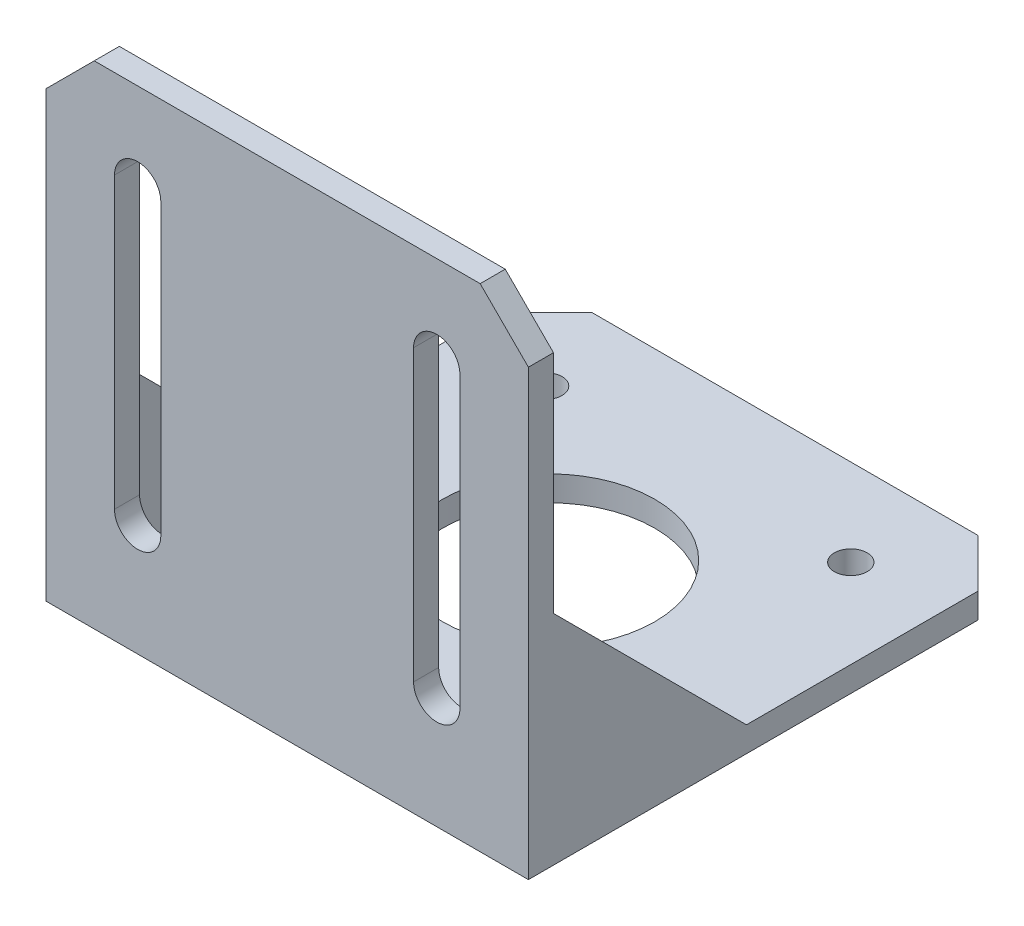
ISO-10303-21;
HEADER;
FILE_DESCRIPTION(('STEP AP214'),'2;1');
FILE_NAME('part.step','',(''),(''),'','','');
FILE_SCHEMA(('AUTOMOTIVE_DESIGN { 1 0 10303 214 1 1 1 1 }'));
ENDSEC;
DATA;
#1=APPLICATION_CONTEXT('core data for automotive mechanical design processes');
#2=APPLICATION_PROTOCOL_DEFINITION('international standard','automotive_design',2000,#1);
#3=PRODUCT_CONTEXT('',#1,'mechanical');
#4=PRODUCT('Part','Part','',(#3));
#5=PRODUCT_RELATED_PRODUCT_CATEGORY('part','',(#4));
#6=PRODUCT_DEFINITION_FORMATION('','',#4);
#7=PRODUCT_DEFINITION_CONTEXT('part definition',#1,'design');
#8=PRODUCT_DEFINITION('design','',#6,#7);
#9=PRODUCT_DEFINITION_SHAPE('','',#8);
#10=(LENGTH_UNIT() NAMED_UNIT(*) SI_UNIT(.MILLI.,.METRE.));
#11=(NAMED_UNIT(*) PLANE_ANGLE_UNIT() SI_UNIT($,.RADIAN.));
#12=(NAMED_UNIT(*) SI_UNIT($,.STERADIAN.) SOLID_ANGLE_UNIT());
#13=UNCERTAINTY_MEASURE_WITH_UNIT(LENGTH_MEASURE(1.E-05),#10,'distance_accuracy_value','');
#14=(GEOMETRIC_REPRESENTATION_CONTEXT(3) GLOBAL_UNCERTAINTY_ASSIGNED_CONTEXT((#13)) GLOBAL_UNIT_ASSIGNED_CONTEXT((#10,
#11,#12)) REPRESENTATION_CONTEXT('',''));
#15=CARTESIAN_POINT('',(0.,0.,0.));
#16=DIRECTION('',(0.,0.,1.));
#17=DIRECTION('',(1.,0.,0.));
#18=AXIS2_PLACEMENT_3D('',#15,#16,#17);
#19=CARTESIAN_POINT('',(0.,2.6,0.));
#20=DIRECTION('',(0.,-1.,0.));
#21=DIRECTION('',(0.,0.,-1.));
#22=AXIS2_PLACEMENT_3D('',#19,#20,#21);
#23=PLANE('',#22);
#24=CARTESIAN_POINT('',(0.,2.6,0.));
#25=DIRECTION('',(0.,1.,0.));
#26=DIRECTION('',(0.,0.,1.));
#27=AXIS2_PLACEMENT_3D('',#24,#25,#26);
#28=CIRCLE('',#27,11.);
#29=CARTESIAN_POINT('',(0.,2.6,11.));
#30=VERTEX_POINT('',#29);
#31=EDGE_CURVE('E316',#30,#30,#28,.T.);
#32=ORIENTED_EDGE('',*,*,#31,.F.);
#33=EDGE_LOOP('',(#32));
#34=FACE_BOUND('',#33,.T.);
#35=CARTESIAN_POINT('',(15.8163265306123,2.6,15.5));
#36=DIRECTION('',(0.,1.,0.));
#37=DIRECTION('',(0.,0.,1.));
#38=AXIS2_PLACEMENT_3D('',#35,#36,#37);
#39=CIRCLE('',#38,1.7);
#40=CARTESIAN_POINT('',(15.8163265306123,2.6,17.2));
#41=VERTEX_POINT('',#40);
#42=EDGE_CURVE('E322',#41,#41,#39,.T.);
#43=ORIENTED_EDGE('',*,*,#42,.F.);
#44=EDGE_LOOP('',(#43));
#45=FACE_BOUND('',#44,.T.);
#46=CARTESIAN_POINT('',(-15.8163265306122,2.6,15.5));
#47=DIRECTION('',(0.,1.,0.));
#48=DIRECTION('',(0.,0.,1.));
#49=AXIS2_PLACEMENT_3D('',#46,#47,#48);
#50=CIRCLE('',#49,1.7);
#51=CARTESIAN_POINT('',(-15.8163265306122,2.6,17.2));
#52=VERTEX_POINT('',#51);
#53=EDGE_CURVE('E328',#52,#52,#50,.T.);
#54=ORIENTED_EDGE('',*,*,#53,.F.);
#55=EDGE_LOOP('',(#54));
#56=FACE_BOUND('',#55,.T.);
#57=CARTESIAN_POINT('',(15.8163265306123,2.6,-15.5));
#58=DIRECTION('',(0.,1.,0.));
#59=DIRECTION('',(0.,0.,1.));
#60=AXIS2_PLACEMENT_3D('',#57,#58,#59);
#61=CIRCLE('',#60,1.7);
#62=CARTESIAN_POINT('',(15.8163265306123,2.6,-13.8));
#63=VERTEX_POINT('',#62);
#64=EDGE_CURVE('E334',#63,#63,#61,.T.);
#65=ORIENTED_EDGE('',*,*,#64,.F.);
#66=EDGE_LOOP('',(#65));
#67=FACE_BOUND('',#66,.T.);
#68=CARTESIAN_POINT('',(-15.8163265306122,2.6,-15.5));
#69=DIRECTION('',(0.,1.,0.));
#70=DIRECTION('',(0.,0.,1.));
#71=AXIS2_PLACEMENT_3D('',#68,#69,#70);
#72=CIRCLE('',#71,1.7);
#73=CARTESIAN_POINT('',(-15.8163265306122,2.6,-13.8));
#74=VERTEX_POINT('',#73);
#75=EDGE_CURVE('E340',#74,#74,#72,.T.);
#76=ORIENTED_EDGE('',*,*,#75,.F.);
#77=EDGE_LOOP('',(#76));
#78=FACE_BOUND('',#77,.T.);
#79=DIRECTION('',(0.,0.,1.));
#80=VECTOR('',#79,1.);
#81=CARTESIAN_POINT('',(-22.4,2.6,24.5));
#82=LINE('',#81,#80);
#83=CARTESIAN_POINT('',(-22.4,2.6,4.50000000000001));
#84=VERTEX_POINT('',#83);
#85=CARTESIAN_POINT('',(-22.4,2.6,24.1));
#86=VERTEX_POINT('',#85);
#87=EDGE_CURVE('E219',#84,#86,#82,.T.);
#88=ORIENTED_EDGE('',*,*,#87,.T.);
#89=DIRECTION('',(1.,0.,0.));
#90=VECTOR('',#89,1.);
#91=CARTESIAN_POINT('',(0.,2.6,24.1));
#92=LINE('',#91,#90);
#93=CARTESIAN_POINT('',(22.4,2.6,24.1));
#94=VERTEX_POINT('',#93);
#95=EDGE_CURVE('E212',#86,#94,#92,.T.);
#96=ORIENTED_EDGE('',*,*,#95,.T.);
#97=DIRECTION('',(0.,0.,1.));
#98=VECTOR('',#97,1.);
#99=CARTESIAN_POINT('',(22.4,2.6,24.5));
#100=LINE('',#99,#98);
#101=CARTESIAN_POINT('',(22.4,2.6,4.50000000000001));
#102=VERTEX_POINT('',#101);
#103=EDGE_CURVE('E194',#102,#94,#100,.T.);
#104=ORIENTED_EDGE('',*,*,#103,.F.);
#105=DIRECTION('',(1.,0.,0.));
#106=VECTOR('',#105,1.);
#107=CARTESIAN_POINT('',(22.4,2.6,4.50000000000001));
#108=LINE('',#107,#106);
#109=CARTESIAN_POINT('',(25.,2.6,4.50000000000001));
#110=VERTEX_POINT('',#109);
#111=EDGE_CURVE('E201',#102,#110,#108,.T.);
#112=ORIENTED_EDGE('',*,*,#111,.T.);
#113=DIRECTION('',(0.,0.,-1.));
#114=VECTOR('',#113,1.);
#115=CARTESIAN_POINT('',(25.,2.6,24.5));
#116=LINE('',#115,#114);
#117=CARTESIAN_POINT('',(25.,2.6,-19.5));
#118=VERTEX_POINT('',#117);
#119=EDGE_CURVE('E346',#110,#118,#116,.T.);
#120=ORIENTED_EDGE('',*,*,#119,.T.);
#121=DIRECTION('',(0.707106781186546,0.,0.707106781186549));
#122=VECTOR('',#121,1.);
#123=CARTESIAN_POINT('',(20.,2.6,-24.5));
#124=LINE('',#123,#122);
#125=CARTESIAN_POINT('',(20.,2.6,-24.5));
#126=VERTEX_POINT('',#125);
#127=EDGE_CURVE('E376',#118,#126,#124,.F.);
#128=ORIENTED_EDGE('',*,*,#127,.T.);
#129=DIRECTION('',(-1.,0.,0.));
#130=VECTOR('',#129,1.);
#131=CARTESIAN_POINT('',(-25.,2.6,-24.5));
#132=LINE('',#131,#130);
#133=CARTESIAN_POINT('',(-20.,2.6,-24.5));
#134=VERTEX_POINT('',#133);
#135=EDGE_CURVE('E348',#126,#134,#132,.T.);
#136=ORIENTED_EDGE('',*,*,#135,.T.);
#137=DIRECTION('',(0.707106781186549,0.,-0.707106781186546));
#138=VECTOR('',#137,1.);
#139=CARTESIAN_POINT('',(-25.,2.6,-19.5));
#140=LINE('',#139,#138);
#141=CARTESIAN_POINT('',(-25.,2.6,-19.5));
#142=VERTEX_POINT('',#141);
#143=EDGE_CURVE('E374',#134,#142,#140,.F.);
#144=ORIENTED_EDGE('',*,*,#143,.T.);
#145=DIRECTION('',(0.,0.,1.));
#146=VECTOR('',#145,1.);
#147=CARTESIAN_POINT('',(-25.,2.6,24.5));
#148=LINE('',#147,#146);
#149=CARTESIAN_POINT('',(-25.,2.6,4.50000000000001));
#150=VERTEX_POINT('',#149);
#151=EDGE_CURVE('E352',#142,#150,#148,.T.);
#152=ORIENTED_EDGE('',*,*,#151,.T.);
#153=DIRECTION('',(-1.,0.,0.));
#154=VECTOR('',#153,1.);
#155=CARTESIAN_POINT('',(-22.4,2.6,4.50000000000001));
#156=LINE('',#155,#154);
#157=EDGE_CURVE('E229',#84,#150,#156,.T.);
#158=ORIENTED_EDGE('',*,*,#157,.F.);
#159=EDGE_LOOP('',(#88,#96,#104,#112,#120,#128,#136,#144,#152,#158));
#160=FACE_BOUND('',#159,.T.);
#161=ADVANCED_FACE('F39',(#34,#45,#56,#67,#78,#160),#23,.F.);
#162=CARTESIAN_POINT('',(0.,0.,24.5));
#163=DIRECTION('',(0.,0.,-1.));
#164=DIRECTION('',(-1.,0.,0.));
#165=AXIS2_PLACEMENT_3D('',#162,#163,#164);
#166=PLANE('',#165);
#167=DIRECTION('',(0.,1.,0.));
#168=VECTOR('',#167,1.);
#169=CARTESIAN_POINT('',(17.9,41.8,24.5));
#170=LINE('',#169,#168);
#171=CARTESIAN_POINT('',(17.9,11.8,24.5));
#172=VERTEX_POINT('',#171);
#173=CARTESIAN_POINT('',(17.9,41.8,24.5));
#174=VERTEX_POINT('',#173);
#175=EDGE_CURVE('E238',#172,#174,#170,.T.);
#176=ORIENTED_EDGE('',*,*,#175,.T.);
#177=CARTESIAN_POINT('',(15.5,41.8,24.5));
#178=DIRECTION('',(0.,0.,1.));
#179=DIRECTION('',(-1.,0.,0.));
#180=AXIS2_PLACEMENT_3D('',#177,#178,#179);
#181=CIRCLE('',#180,2.4);
#182=CARTESIAN_POINT('',(13.1,41.8,24.5));
#183=VERTEX_POINT('',#182);
#184=EDGE_CURVE('E232',#174,#183,#181,.T.);
#185=ORIENTED_EDGE('',*,*,#184,.T.);
#186=DIRECTION('',(0.,-1.,0.));
#187=VECTOR('',#186,1.);
#188=CARTESIAN_POINT('',(13.1,41.8,24.5));
#189=LINE('',#188,#187);
#190=CARTESIAN_POINT('',(13.1,11.8,24.5));
#191=VERTEX_POINT('',#190);
#192=EDGE_CURVE('E248',#183,#191,#189,.T.);
#193=ORIENTED_EDGE('',*,*,#192,.T.);
#194=CARTESIAN_POINT('',(15.5,11.8,24.5));
#195=DIRECTION('',(0.,0.,1.));
#196=DIRECTION('',(-1.,0.,0.));
#197=AXIS2_PLACEMENT_3D('',#194,#195,#196);
#198=CIRCLE('',#197,2.4);
#199=EDGE_CURVE('E251',#191,#172,#198,.T.);
#200=ORIENTED_EDGE('',*,*,#199,.T.);
#201=EDGE_LOOP('',(#176,#185,#193,#200));
#202=FACE_BOUND('',#201,.T.);
#203=DIRECTION('',(0.,1.,0.));
#204=VECTOR('',#203,1.);
#205=CARTESIAN_POINT('',(-13.1,41.8,24.5));
#206=LINE('',#205,#204);
#207=CARTESIAN_POINT('',(-13.1,11.8,24.5));
#208=VERTEX_POINT('',#207);
#209=CARTESIAN_POINT('',(-13.1,41.8,24.5));
#210=VERTEX_POINT('',#209);
#211=EDGE_CURVE('E269',#208,#210,#206,.T.);
#212=ORIENTED_EDGE('',*,*,#211,.T.);
#213=CARTESIAN_POINT('',(-15.5,41.8,24.5));
#214=DIRECTION('',(0.,0.,1.));
#215=DIRECTION('',(1.,0.,0.));
#216=AXIS2_PLACEMENT_3D('',#213,#214,#215);
#217=CIRCLE('',#216,2.4);
#218=CARTESIAN_POINT('',(-17.9,41.8,24.5));
#219=VERTEX_POINT('',#218);
#220=EDGE_CURVE('E265',#210,#219,#217,.T.);
#221=ORIENTED_EDGE('',*,*,#220,.T.);
#222=DIRECTION('',(0.,-1.,0.));
#223=VECTOR('',#222,1.);
#224=CARTESIAN_POINT('',(-17.9,41.8,24.5));
#225=LINE('',#224,#223);
#226=CARTESIAN_POINT('',(-17.9,11.8,24.5));
#227=VERTEX_POINT('',#226);
#228=EDGE_CURVE('E279',#219,#227,#225,.T.);
#229=ORIENTED_EDGE('',*,*,#228,.T.);
#230=CARTESIAN_POINT('',(-15.5,11.8,24.5));
#231=DIRECTION('',(0.,0.,1.));
#232=DIRECTION('',(1.,0.,0.));
#233=AXIS2_PLACEMENT_3D('',#230,#231,#232);
#234=CIRCLE('',#233,2.4);
#235=EDGE_CURVE('E282',#227,#208,#234,.T.);
#236=ORIENTED_EDGE('',*,*,#235,.T.);
#237=EDGE_LOOP('',(#212,#221,#229,#236));
#238=FACE_BOUND('',#237,.T.);
#239=DIRECTION('',(0.,1.,0.));
#240=VECTOR('',#239,1.);
#241=CARTESIAN_POINT('',(22.4,22.6,24.5));
#242=LINE('',#241,#240);
#243=CARTESIAN_POINT('',(22.4,2.99999999999999,24.5));
#244=VERTEX_POINT('',#243);
#245=CARTESIAN_POINT('',(22.4,22.6,24.5));
#246=VERTEX_POINT('',#245);
#247=EDGE_CURVE('E195',#244,#246,#242,.T.);
#248=ORIENTED_EDGE('',*,*,#247,.F.);
#249=DIRECTION('',(-1.,0.,0.));
#250=VECTOR('',#249,1.);
#251=CARTESIAN_POINT('',(0.,2.99999999999999,24.5));
#252=LINE('',#251,#250);
#253=CARTESIAN_POINT('',(-22.4,2.99999999999999,24.5));
#254=VERTEX_POINT('',#253);
#255=EDGE_CURVE('E47',#244,#254,#252,.T.);
#256=ORIENTED_EDGE('',*,*,#255,.T.);
#257=DIRECTION('',(0.,1.,0.));
#258=VECTOR('',#257,1.);
#259=CARTESIAN_POINT('',(-22.4,22.6,24.5));
#260=LINE('',#259,#258);
#261=CARTESIAN_POINT('',(-22.4,22.6,24.5));
#262=VERTEX_POINT('',#261);
#263=EDGE_CURVE('E221',#254,#262,#260,.T.);
#264=ORIENTED_EDGE('',*,*,#263,.T.);
#265=DIRECTION('',(-1.,0.,0.));
#266=VECTOR('',#265,1.);
#267=CARTESIAN_POINT('',(-22.4,22.6,24.5));
#268=LINE('',#267,#266);
#269=CARTESIAN_POINT('',(-25.,22.6,24.5));
#270=VERTEX_POINT('',#269);
#271=EDGE_CURVE('E226',#262,#270,#268,.T.);
#272=ORIENTED_EDGE('',*,*,#271,.T.);
#273=DIRECTION('',(0.,-1.,0.));
#274=VECTOR('',#273,1.);
#275=CARTESIAN_POINT('',(-25.,0.,24.5));
#276=LINE('',#275,#274);
#277=CARTESIAN_POINT('',(-25.,46.,24.5));
#278=VERTEX_POINT('',#277);
#279=EDGE_CURVE('E296',#278,#270,#276,.T.);
#280=ORIENTED_EDGE('',*,*,#279,.F.);
#281=DIRECTION('',(-0.707106781186549,-0.707106781186546,0.));
#282=VECTOR('',#281,1.);
#283=CARTESIAN_POINT('',(-35.4999999999999,35.5000000000001,24.5));
#284=LINE('',#283,#282);
#285=CARTESIAN_POINT('',(-20.,51.,24.5));
#286=VERTEX_POINT('',#285);
#287=EDGE_CURVE('E389',#278,#286,#284,.F.);
#288=ORIENTED_EDGE('',*,*,#287,.T.);
#289=DIRECTION('',(-1.,0.,0.));
#290=VECTOR('',#289,1.);
#291=CARTESIAN_POINT('',(-25.,51.,24.5));
#292=LINE('',#291,#290);
#293=CARTESIAN_POINT('',(20.,51.,24.5));
#294=VERTEX_POINT('',#293);
#295=EDGE_CURVE('E300',#294,#286,#292,.T.);
#296=ORIENTED_EDGE('',*,*,#295,.F.);
#297=DIRECTION('',(-0.707106781186546,0.707106781186549,0.));
#298=VECTOR('',#297,1.);
#299=CARTESIAN_POINT('',(35.5,35.4999999999999,24.5));
#300=LINE('',#299,#298);
#301=CARTESIAN_POINT('',(25.,46.,24.5));
#302=VERTEX_POINT('',#301);
#303=EDGE_CURVE('E391',#294,#302,#300,.F.);
#304=ORIENTED_EDGE('',*,*,#303,.T.);
#305=DIRECTION('',(0.,1.,0.));
#306=VECTOR('',#305,1.);
#307=CARTESIAN_POINT('',(25.,0.,24.5));
#308=LINE('',#307,#306);
#309=CARTESIAN_POINT('',(25.,22.6,24.5));
#310=VERTEX_POINT('',#309);
#311=EDGE_CURVE('E311',#310,#302,#308,.T.);
#312=ORIENTED_EDGE('',*,*,#311,.F.);
#313=DIRECTION('',(1.,0.,0.));
#314=VECTOR('',#313,1.);
#315=CARTESIAN_POINT('',(22.4,22.6,24.5));
#316=LINE('',#315,#314);
#317=EDGE_CURVE('E207',#246,#310,#316,.T.);
#318=ORIENTED_EDGE('',*,*,#317,.F.);
#319=EDGE_LOOP('',(#248,#256,#264,#272,#280,#288,#296,#304,#312,#318));
#320=FACE_BOUND('',#319,.T.);
#321=ADVANCED_FACE('F414',(#202,#238,#320),#166,.T.);
#322=CARTESIAN_POINT('',(0.,0.,0.));
#323=DIRECTION('',(0.,-1.,0.));
#324=DIRECTION('',(0.,0.,-1.));
#325=AXIS2_PLACEMENT_3D('',#322,#323,#324);
#326=PLANE('',#325);
#327=CARTESIAN_POINT('',(15.8163265306123,0.,15.5));
#328=DIRECTION('',(0.,1.,0.));
#329=DIRECTION('',(0.,0.,1.));
#330=AXIS2_PLACEMENT_3D('',#327,#328,#329);
#331=CIRCLE('',#330,1.7);
#332=CARTESIAN_POINT('',(15.8163265306123,0.,17.2));
#333=VERTEX_POINT('',#332);
#334=EDGE_CURVE('E319',#333,#333,#331,.T.);
#335=ORIENTED_EDGE('',*,*,#334,.T.);
#336=EDGE_LOOP('',(#335));
#337=FACE_BOUND('',#336,.T.);
#338=CARTESIAN_POINT('',(15.8163265306123,0.,-15.5));
#339=DIRECTION('',(0.,1.,0.));
#340=DIRECTION('',(0.,0.,1.));
#341=AXIS2_PLACEMENT_3D('',#338,#339,#340);
#342=CIRCLE('',#341,1.7);
#343=CARTESIAN_POINT('',(15.8163265306123,0.,-13.8));
#344=VERTEX_POINT('',#343);
#345=EDGE_CURVE('E331',#344,#344,#342,.T.);
#346=ORIENTED_EDGE('',*,*,#345,.T.);
#347=EDGE_LOOP('',(#346));
#348=FACE_BOUND('',#347,.T.);
#349=DIRECTION('',(-1.,0.,0.));
#350=VECTOR('',#349,1.);
#351=CARTESIAN_POINT('',(-25.,0.,-24.5));
#352=LINE('',#351,#350);
#353=CARTESIAN_POINT('',(20.,0.,-24.5));
#354=VERTEX_POINT('',#353);
#355=CARTESIAN_POINT('',(-20.,0.,-24.5));
#356=VERTEX_POINT('',#355);
#357=EDGE_CURVE('E357',#354,#356,#352,.T.);
#358=ORIENTED_EDGE('',*,*,#357,.F.);
#359=DIRECTION('',(-0.707106781186546,0.,-0.707106781186549));
#360=VECTOR('',#359,1.);
#361=CARTESIAN_POINT('',(22.25,0.,-22.2499999999999));
#362=LINE('',#361,#360);
#363=CARTESIAN_POINT('',(25.,0.,-19.5));
#364=VERTEX_POINT('',#363);
#365=EDGE_CURVE('E368',#354,#364,#362,.F.);
#366=ORIENTED_EDGE('',*,*,#365,.T.);
#367=DIRECTION('',(0.,0.,-1.));
#368=VECTOR('',#367,1.);
#369=CARTESIAN_POINT('',(25.,0.,24.5));
#370=LINE('',#369,#368);
#371=CARTESIAN_POINT('',(25.,0.,27.1));
#372=VERTEX_POINT('',#371);
#373=EDGE_CURVE('E343',#372,#364,#370,.T.);
#374=ORIENTED_EDGE('',*,*,#373,.F.);
#375=DIRECTION('',(1.,0.,0.));
#376=VECTOR('',#375,1.);
#377=CARTESIAN_POINT('',(-25.,0.,27.1));
#378=LINE('',#377,#376);
#379=CARTESIAN_POINT('',(-25.,0.,27.1));
#380=VERTEX_POINT('',#379);
#381=EDGE_CURVE('E299',#380,#372,#378,.T.);
#382=ORIENTED_EDGE('',*,*,#381,.F.);
#383=DIRECTION('',(0.,0.,1.));
#384=VECTOR('',#383,1.);
#385=CARTESIAN_POINT('',(-25.,0.,24.5));
#386=LINE('',#385,#384);
#387=CARTESIAN_POINT('',(-25.,0.,-19.5));
#388=VERTEX_POINT('',#387);
#389=EDGE_CURVE('E349',#388,#380,#386,.T.);
#390=ORIENTED_EDGE('',*,*,#389,.F.);
#391=DIRECTION('',(-0.707106781186549,0.,0.707106781186546));
#392=VECTOR('',#391,1.);
#393=CARTESIAN_POINT('',(-22.2499999999999,0.,-22.25));
#394=LINE('',#393,#392);
#395=EDGE_CURVE('E366',#388,#356,#394,.F.);
#396=ORIENTED_EDGE('',*,*,#395,.T.);
#397=EDGE_LOOP('',(#358,#366,#374,#382,#390,#396));
#398=FACE_BOUND('',#397,.T.);
#399=CARTESIAN_POINT('',(-15.8163265306122,0.,-15.5));
#400=DIRECTION('',(0.,1.,0.));
#401=DIRECTION('',(0.,0.,1.));
#402=AXIS2_PLACEMENT_3D('',#399,#400,#401);
#403=CIRCLE('',#402,1.7);
#404=CARTESIAN_POINT('',(-15.8163265306122,0.,-13.8));
#405=VERTEX_POINT('',#404);
#406=EDGE_CURVE('E337',#405,#405,#403,.T.);
#407=ORIENTED_EDGE('',*,*,#406,.T.);
#408=EDGE_LOOP('',(#407));
#409=FACE_BOUND('',#408,.T.);
#410=CARTESIAN_POINT('',(-15.8163265306122,0.,15.5));
#411=DIRECTION('',(0.,1.,0.));
#412=DIRECTION('',(0.,0.,1.));
#413=AXIS2_PLACEMENT_3D('',#410,#411,#412);
#414=CIRCLE('',#413,1.7);
#415=CARTESIAN_POINT('',(-15.8163265306122,0.,17.2));
#416=VERTEX_POINT('',#415);
#417=EDGE_CURVE('E325',#416,#416,#414,.T.);
#418=ORIENTED_EDGE('',*,*,#417,.T.);
#419=EDGE_LOOP('',(#418));
#420=FACE_BOUND('',#419,.T.);
#421=CARTESIAN_POINT('',(0.,0.,0.));
#422=DIRECTION('',(0.,1.,0.));
#423=DIRECTION('',(0.,0.,1.));
#424=AXIS2_PLACEMENT_3D('',#421,#422,#423);
#425=CIRCLE('',#424,11.);
#426=CARTESIAN_POINT('',(0.,0.,11.));
#427=VERTEX_POINT('',#426);
#428=EDGE_CURVE('E309',#427,#427,#425,.T.);
#429=ORIENTED_EDGE('',*,*,#428,.T.);
#430=EDGE_LOOP('',(#429));
#431=FACE_BOUND('',#430,.T.);
#432=ADVANCED_FACE('F440',(#337,#348,#398,#409,#420,#431),#326,.T.);
#433=CARTESIAN_POINT('',(25.,2.6,24.5));
#434=DIRECTION('',(-1.,0.,0.));
#435=DIRECTION('',(0.,0.,1.));
#436=AXIS2_PLACEMENT_3D('',#433,#434,#435);
#437=PLANE('',#436);
#438=ORIENTED_EDGE('',*,*,#373,.T.);
#439=DIRECTION('',(0.,1.,0.));
#440=VECTOR('',#439,1.);
#441=CARTESIAN_POINT('',(25.,2.6,-19.5));
#442=LINE('',#441,#440);
#443=EDGE_CURVE('E372',#364,#118,#442,.T.);
#444=ORIENTED_EDGE('',*,*,#443,.T.);
#445=ORIENTED_EDGE('',*,*,#119,.F.);
#446=DIRECTION('',(0.,-0.707106781186548,-0.707106781186547));
#447=VECTOR('',#446,1.);
#448=CARTESIAN_POINT('',(25.,2.6,4.50000000000001));
#449=LINE('',#448,#447);
#450=EDGE_CURVE('E203',#310,#110,#449,.T.);
#451=ORIENTED_EDGE('',*,*,#450,.F.);
#452=ORIENTED_EDGE('',*,*,#311,.T.);
#453=DIRECTION('',(0.,0.,1.));
#454=VECTOR('',#453,1.);
#455=CARTESIAN_POINT('',(25.,46.,24.5));
#456=LINE('',#455,#454);
#457=CARTESIAN_POINT('',(25.,46.,27.1));
#458=VERTEX_POINT('',#457);
#459=EDGE_CURVE('E370',#302,#458,#456,.T.);
#460=ORIENTED_EDGE('',*,*,#459,.T.);
#461=DIRECTION('',(0.,1.,0.));
#462=VECTOR('',#461,1.);
#463=CARTESIAN_POINT('',(25.,0.,27.1));
#464=LINE('',#463,#462);
#465=EDGE_CURVE('E303',#372,#458,#464,.T.);
#466=ORIENTED_EDGE('',*,*,#465,.F.);
#467=EDGE_LOOP('',(#438,#444,#445,#451,#452,#460,#466));
#468=FACE_BOUND('',#467,.T.);
#469=ADVANCED_FACE('F416',(#468),#437,.F.);
#470=CARTESIAN_POINT('',(-25.,2.6,-24.5));
#471=DIRECTION('',(0.,0.,1.));
#472=DIRECTION('',(1.,0.,0.));
#473=AXIS2_PLACEMENT_3D('',#470,#471,#472);
#474=PLANE('',#473);
#475=ORIENTED_EDGE('',*,*,#135,.F.);
#476=DIRECTION('',(0.,-1.,0.));
#477=VECTOR('',#476,1.);
#478=CARTESIAN_POINT('',(20.,2.6,-24.5));
#479=LINE('',#478,#477);
#480=EDGE_CURVE('E363',#126,#354,#479,.T.);
#481=ORIENTED_EDGE('',*,*,#480,.T.);
#482=ORIENTED_EDGE('',*,*,#357,.T.);
#483=DIRECTION('',(0.,1.,0.));
#484=VECTOR('',#483,1.);
#485=CARTESIAN_POINT('',(-20.,2.6,-24.5));
#486=LINE('',#485,#484);
#487=EDGE_CURVE('E354',#356,#134,#486,.T.);
#488=ORIENTED_EDGE('',*,*,#487,.T.);
#489=EDGE_LOOP('',(#475,#481,#482,#488));
#490=FACE_BOUND('',#489,.T.);
#491=ADVANCED_FACE('F450',(#490),#474,.F.);
#492=CARTESIAN_POINT('',(-25.,2.6,24.5));
#493=DIRECTION('',(1.,0.,0.));
#494=DIRECTION('',(0.,0.,-1.));
#495=AXIS2_PLACEMENT_3D('',#492,#493,#494);
#496=PLANE('',#495);
#497=ORIENTED_EDGE('',*,*,#151,.F.);
#498=DIRECTION('',(0.,-1.,0.));
#499=VECTOR('',#498,1.);
#500=CARTESIAN_POINT('',(-25.,2.6,-19.5));
#501=LINE('',#500,#499);
#502=EDGE_CURVE('E381',#142,#388,#501,.T.);
#503=ORIENTED_EDGE('',*,*,#502,.T.);
#504=ORIENTED_EDGE('',*,*,#389,.T.);
#505=DIRECTION('',(0.,-1.,0.));
#506=VECTOR('',#505,1.);
#507=CARTESIAN_POINT('',(-25.,0.,27.1));
#508=LINE('',#507,#506);
#509=CARTESIAN_POINT('',(-25.,46.,27.1));
#510=VERTEX_POINT('',#509);
#511=EDGE_CURVE('E297',#510,#380,#508,.T.);
#512=ORIENTED_EDGE('',*,*,#511,.F.);
#513=DIRECTION('',(0.,0.,-1.));
#514=VECTOR('',#513,1.);
#515=CARTESIAN_POINT('',(-25.,46.,24.5));
#516=LINE('',#515,#514);
#517=EDGE_CURVE('E378',#510,#278,#516,.T.);
#518=ORIENTED_EDGE('',*,*,#517,.T.);
#519=ORIENTED_EDGE('',*,*,#279,.T.);
#520=DIRECTION('',(0.,-0.707106781186548,-0.707106781186547));
#521=VECTOR('',#520,1.);
#522=CARTESIAN_POINT('',(-25.,2.6,4.50000000000001));
#523=LINE('',#522,#521);
#524=EDGE_CURVE('E217',#270,#150,#523,.T.);
#525=ORIENTED_EDGE('',*,*,#524,.T.);
#526=EDGE_LOOP('',(#497,#503,#504,#512,#518,#519,#525));
#527=FACE_BOUND('',#526,.T.);
#528=ADVANCED_FACE('F429',(#527),#496,.F.);
#529=CARTESIAN_POINT('',(-15.8163265306122,2.6,-15.5));
#530=DIRECTION('',(0.,-1.,0.));
#531=DIRECTION('',(0.,0.,-1.));
#532=AXIS2_PLACEMENT_3D('',#529,#530,#531);
#533=CYLINDRICAL_SURFACE('',#532,1.7);
#534=ORIENTED_EDGE('',*,*,#75,.T.);
#535=EDGE_LOOP('',(#534));
#536=FACE_BOUND('',#535,.T.);
#537=ORIENTED_EDGE('',*,*,#406,.F.);
#538=EDGE_LOOP('',(#537));
#539=FACE_BOUND('',#538,.T.);
#540=ADVANCED_FACE('F475',(#536,#539),#533,.F.);
#541=CARTESIAN_POINT('',(15.8163265306123,2.6,-15.5));
#542=DIRECTION('',(0.,-1.,0.));
#543=DIRECTION('',(0.,0.,-1.));
#544=AXIS2_PLACEMENT_3D('',#541,#542,#543);
#545=CYLINDRICAL_SURFACE('',#544,1.7);
#546=ORIENTED_EDGE('',*,*,#64,.T.);
#547=EDGE_LOOP('',(#546));
#548=FACE_BOUND('',#547,.T.);
#549=ORIENTED_EDGE('',*,*,#345,.F.);
#550=EDGE_LOOP('',(#549));
#551=FACE_BOUND('',#550,.T.);
#552=ADVANCED_FACE('F611',(#548,#551),#545,.F.);
#553=CARTESIAN_POINT('',(-15.8163265306122,2.6,15.5));
#554=DIRECTION('',(0.,-1.,0.));
#555=DIRECTION('',(0.,0.,-1.));
#556=AXIS2_PLACEMENT_3D('',#553,#554,#555);
#557=CYLINDRICAL_SURFACE('',#556,1.7);
#558=ORIENTED_EDGE('',*,*,#53,.T.);
#559=EDGE_LOOP('',(#558));
#560=FACE_BOUND('',#559,.T.);
#561=ORIENTED_EDGE('',*,*,#417,.F.);
#562=EDGE_LOOP('',(#561));
#563=FACE_BOUND('',#562,.T.);
#564=ADVANCED_FACE('F608',(#560,#563),#557,.F.);
#565=CARTESIAN_POINT('',(15.8163265306123,2.6,15.5));
#566=DIRECTION('',(0.,-1.,0.));
#567=DIRECTION('',(0.,0.,-1.));
#568=AXIS2_PLACEMENT_3D('',#565,#566,#567);
#569=CYLINDRICAL_SURFACE('',#568,1.7);
#570=ORIENTED_EDGE('',*,*,#42,.T.);
#571=EDGE_LOOP('',(#570));
#572=FACE_BOUND('',#571,.T.);
#573=ORIENTED_EDGE('',*,*,#334,.F.);
#574=EDGE_LOOP('',(#573));
#575=FACE_BOUND('',#574,.T.);
#576=ADVANCED_FACE('F604',(#572,#575),#569,.F.);
#577=CARTESIAN_POINT('',(0.,2.6,0.));
#578=DIRECTION('',(0.,-1.,0.));
#579=DIRECTION('',(0.,0.,-1.));
#580=AXIS2_PLACEMENT_3D('',#577,#578,#579);
#581=CYLINDRICAL_SURFACE('',#580,11.);
#582=ORIENTED_EDGE('',*,*,#31,.T.);
#583=EDGE_LOOP('',(#582));
#584=FACE_BOUND('',#583,.T.);
#585=ORIENTED_EDGE('',*,*,#428,.F.);
#586=EDGE_LOOP('',(#585));
#587=FACE_BOUND('',#586,.T.);
#588=ADVANCED_FACE('F511',(#584,#587),#581,.F.);
#589=CARTESIAN_POINT('',(0.,0.,27.1));
#590=DIRECTION('',(0.,0.,-1.));
#591=DIRECTION('',(-1.,0.,0.));
#592=AXIS2_PLACEMENT_3D('',#589,#590,#591);
#593=PLANE('',#592);
#594=CARTESIAN_POINT('',(-15.5,41.8,27.1));
#595=DIRECTION('',(0.,0.,1.));
#596=DIRECTION('',(1.,0.,0.));
#597=AXIS2_PLACEMENT_3D('',#594,#595,#596);
#598=CIRCLE('',#597,2.4);
#599=CARTESIAN_POINT('',(-13.1,41.8,27.1));
#600=VERTEX_POINT('',#599);
#601=CARTESIAN_POINT('',(-17.9,41.8,27.1));
#602=VERTEX_POINT('',#601);
#603=EDGE_CURVE('E266',#600,#602,#598,.T.);
#604=ORIENTED_EDGE('',*,*,#603,.F.);
#605=DIRECTION('',(0.,1.,0.));
#606=VECTOR('',#605,1.);
#607=CARTESIAN_POINT('',(-13.1,41.8,27.1));
#608=LINE('',#607,#606);
#609=CARTESIAN_POINT('',(-13.1,11.8,27.1));
#610=VERTEX_POINT('',#609);
#611=EDGE_CURVE('E274',#610,#600,#608,.T.);
#612=ORIENTED_EDGE('',*,*,#611,.F.);
#613=CARTESIAN_POINT('',(-15.5,11.8,27.1));
#614=DIRECTION('',(0.,0.,1.));
#615=DIRECTION('',(1.,0.,0.));
#616=AXIS2_PLACEMENT_3D('',#613,#614,#615);
#617=CIRCLE('',#616,2.4);
#618=CARTESIAN_POINT('',(-17.9,11.8,27.1));
#619=VERTEX_POINT('',#618);
#620=EDGE_CURVE('E271',#619,#610,#617,.T.);
#621=ORIENTED_EDGE('',*,*,#620,.F.);
#622=DIRECTION('',(0.,-1.,0.));
#623=VECTOR('',#622,1.);
#624=CARTESIAN_POINT('',(-17.9,41.8,27.1));
#625=LINE('',#624,#623);
#626=EDGE_CURVE('E268',#602,#619,#625,.T.);
#627=ORIENTED_EDGE('',*,*,#626,.F.);
#628=EDGE_LOOP('',(#604,#612,#621,#627));
#629=FACE_BOUND('',#628,.T.);
#630=ORIENTED_EDGE('',*,*,#465,.T.);
#631=DIRECTION('',(0.707106781186546,-0.707106781186549,0.));
#632=VECTOR('',#631,1.);
#633=CARTESIAN_POINT('',(20.,51.,27.1));
#634=LINE('',#633,#632);
#635=CARTESIAN_POINT('',(20.,51.,27.1));
#636=VERTEX_POINT('',#635);
#637=EDGE_CURVE('E395',#458,#636,#634,.F.);
#638=ORIENTED_EDGE('',*,*,#637,.T.);
#639=DIRECTION('',(-1.,0.,0.));
#640=VECTOR('',#639,1.);
#641=CARTESIAN_POINT('',(-25.,51.,27.1));
#642=LINE('',#641,#640);
#643=CARTESIAN_POINT('',(-20.,51.,27.1));
#644=VERTEX_POINT('',#643);
#645=EDGE_CURVE('E306',#636,#644,#642,.T.);
#646=ORIENTED_EDGE('',*,*,#645,.T.);
#647=DIRECTION('',(0.707106781186549,0.707106781186546,0.));
#648=VECTOR('',#647,1.);
#649=CARTESIAN_POINT('',(-25.,46.,27.1));
#650=LINE('',#649,#648);
#651=EDGE_CURVE('E393',#644,#510,#650,.F.);
#652=ORIENTED_EDGE('',*,*,#651,.T.);
#653=ORIENTED_EDGE('',*,*,#511,.T.);
#654=ORIENTED_EDGE('',*,*,#381,.T.);
#655=EDGE_LOOP('',(#630,#638,#646,#652,#653,#654));
#656=FACE_BOUND('',#655,.T.);
#657=CARTESIAN_POINT('',(15.5,41.8,27.1));
#658=DIRECTION('',(0.,0.,1.));
#659=DIRECTION('',(-1.,0.,0.));
#660=AXIS2_PLACEMENT_3D('',#657,#658,#659);
#661=CIRCLE('',#660,2.4);
#662=CARTESIAN_POINT('',(17.9,41.8,27.1));
#663=VERTEX_POINT('',#662);
#664=CARTESIAN_POINT('',(13.1,41.8,27.1));
#665=VERTEX_POINT('',#664);
#666=EDGE_CURVE('E235',#663,#665,#661,.T.);
#667=ORIENTED_EDGE('',*,*,#666,.F.);
#668=DIRECTION('',(0.,1.,0.));
#669=VECTOR('',#668,1.);
#670=CARTESIAN_POINT('',(17.9,41.8,27.1));
#671=LINE('',#670,#669);
#672=CARTESIAN_POINT('',(17.9,11.8,27.1));
#673=VERTEX_POINT('',#672);
#674=EDGE_CURVE('E243',#673,#663,#671,.T.);
#675=ORIENTED_EDGE('',*,*,#674,.F.);
#676=CARTESIAN_POINT('',(15.5,11.8,27.1));
#677=DIRECTION('',(0.,0.,1.));
#678=DIRECTION('',(-1.,0.,0.));
#679=AXIS2_PLACEMENT_3D('',#676,#677,#678);
#680=CIRCLE('',#679,2.4);
#681=CARTESIAN_POINT('',(13.1,11.8,27.1));
#682=VERTEX_POINT('',#681);
#683=EDGE_CURVE('E240',#682,#673,#680,.T.);
#684=ORIENTED_EDGE('',*,*,#683,.F.);
#685=DIRECTION('',(0.,-1.,0.));
#686=VECTOR('',#685,1.);
#687=CARTESIAN_POINT('',(13.1,41.8,27.1));
#688=LINE('',#687,#686);
#689=EDGE_CURVE('E237',#665,#682,#688,.T.);
#690=ORIENTED_EDGE('',*,*,#689,.F.);
#691=EDGE_LOOP('',(#667,#675,#684,#690));
#692=FACE_BOUND('',#691,.T.);
#693=ADVANCED_FACE('F401',(#629,#656,#692),#593,.F.);
#694=CARTESIAN_POINT('',(-25.,51.,27.1));
#695=DIRECTION('',(0.,-1.,0.));
#696=DIRECTION('',(0.,0.,-1.));
#697=AXIS2_PLACEMENT_3D('',#694,#695,#696);
#698=PLANE('',#697);
#699=ORIENTED_EDGE('',*,*,#645,.F.);
#700=DIRECTION('',(0.,0.,-1.));
#701=VECTOR('',#700,1.);
#702=CARTESIAN_POINT('',(20.,51.,27.1));
#703=LINE('',#702,#701);
#704=EDGE_CURVE('E386',#636,#294,#703,.T.);
#705=ORIENTED_EDGE('',*,*,#704,.T.);
#706=ORIENTED_EDGE('',*,*,#295,.T.);
#707=DIRECTION('',(0.,0.,1.));
#708=VECTOR('',#707,1.);
#709=CARTESIAN_POINT('',(-20.,51.,27.1));
#710=LINE('',#709,#708);
#711=EDGE_CURVE('E384',#286,#644,#710,.T.);
#712=ORIENTED_EDGE('',*,*,#711,.T.);
#713=EDGE_LOOP('',(#699,#705,#706,#712));
#714=FACE_BOUND('',#713,.T.);
#715=ADVANCED_FACE('F409',(#714),#698,.F.);
#716=CARTESIAN_POINT('',(-15.5,41.8,27.1));
#717=DIRECTION('',(0.,0.,-1.));
#718=DIRECTION('',(-1.,0.,0.));
#719=AXIS2_PLACEMENT_3D('',#716,#717,#718);
#720=CYLINDRICAL_SURFACE('',#719,2.4);
#721=ORIENTED_EDGE('',*,*,#220,.F.);
#722=DIRECTION('',(0.,0.,-1.));
#723=VECTOR('',#722,1.);
#724=CARTESIAN_POINT('',(-13.1,41.8,27.1));
#725=LINE('',#724,#723);
#726=EDGE_CURVE('E276',#600,#210,#725,.T.);
#727=ORIENTED_EDGE('',*,*,#726,.F.);
#728=ORIENTED_EDGE('',*,*,#603,.T.);
#729=DIRECTION('',(0.,0.,-1.));
#730=VECTOR('',#729,1.);
#731=CARTESIAN_POINT('',(-17.9,41.8,27.1));
#732=LINE('',#731,#730);
#733=EDGE_CURVE('E293',#602,#219,#732,.T.);
#734=ORIENTED_EDGE('',*,*,#733,.T.);
#735=EDGE_LOOP('',(#721,#727,#728,#734));
#736=FACE_BOUND('',#735,.T.);
#737=ADVANCED_FACE('F518',(#736),#720,.F.);
#738=CARTESIAN_POINT('',(-17.9,41.8,27.1));
#739=DIRECTION('',(1.,0.,0.));
#740=DIRECTION('',(0.,0.,-1.));
#741=AXIS2_PLACEMENT_3D('',#738,#739,#740);
#742=PLANE('',#741);
#743=ORIENTED_EDGE('',*,*,#228,.F.);
#744=ORIENTED_EDGE('',*,*,#733,.F.);
#745=ORIENTED_EDGE('',*,*,#626,.T.);
#746=DIRECTION('',(0.,0.,-1.));
#747=VECTOR('',#746,1.);
#748=CARTESIAN_POINT('',(-17.9,11.8,27.1));
#749=LINE('',#748,#747);
#750=EDGE_CURVE('E291',#619,#227,#749,.T.);
#751=ORIENTED_EDGE('',*,*,#750,.T.);
#752=EDGE_LOOP('',(#743,#744,#745,#751));
#753=FACE_BOUND('',#752,.T.);
#754=ADVANCED_FACE('F594',(#753),#742,.T.);
#755=CARTESIAN_POINT('',(-15.5,11.8,27.1));
#756=DIRECTION('',(0.,0.,-1.));
#757=DIRECTION('',(-1.,0.,0.));
#758=AXIS2_PLACEMENT_3D('',#755,#756,#757);
#759=CYLINDRICAL_SURFACE('',#758,2.4);
#760=ORIENTED_EDGE('',*,*,#235,.F.);
#761=ORIENTED_EDGE('',*,*,#750,.F.);
#762=ORIENTED_EDGE('',*,*,#620,.T.);
#763=DIRECTION('',(0.,0.,-1.));
#764=VECTOR('',#763,1.);
#765=CARTESIAN_POINT('',(-13.1,11.8,27.1));
#766=LINE('',#765,#764);
#767=EDGE_CURVE('E289',#610,#208,#766,.T.);
#768=ORIENTED_EDGE('',*,*,#767,.T.);
#769=EDGE_LOOP('',(#760,#761,#762,#768));
#770=FACE_BOUND('',#769,.T.);
#771=ADVANCED_FACE('F590',(#770),#759,.F.);
#772=CARTESIAN_POINT('',(-13.1,41.8,27.1));
#773=DIRECTION('',(-1.,0.,0.));
#774=DIRECTION('',(0.,0.,1.));
#775=AXIS2_PLACEMENT_3D('',#772,#773,#774);
#776=PLANE('',#775);
#777=ORIENTED_EDGE('',*,*,#211,.F.);
#778=ORIENTED_EDGE('',*,*,#767,.F.);
#779=ORIENTED_EDGE('',*,*,#611,.T.);
#780=ORIENTED_EDGE('',*,*,#726,.T.);
#781=EDGE_LOOP('',(#777,#778,#779,#780));
#782=FACE_BOUND('',#781,.T.);
#783=ADVANCED_FACE('F586',(#782),#776,.T.);
#784=CARTESIAN_POINT('',(15.5,41.8,27.1));
#785=DIRECTION('',(0.,0.,-1.));
#786=DIRECTION('',(-1.,0.,0.));
#787=AXIS2_PLACEMENT_3D('',#784,#785,#786);
#788=CYLINDRICAL_SURFACE('',#787,2.4);
#789=ORIENTED_EDGE('',*,*,#184,.F.);
#790=DIRECTION('',(0.,0.,-1.));
#791=VECTOR('',#790,1.);
#792=CARTESIAN_POINT('',(17.9,41.8,27.1));
#793=LINE('',#792,#791);
#794=EDGE_CURVE('E245',#663,#174,#793,.T.);
#795=ORIENTED_EDGE('',*,*,#794,.F.);
#796=ORIENTED_EDGE('',*,*,#666,.T.);
#797=DIRECTION('',(0.,0.,-1.));
#798=VECTOR('',#797,1.);
#799=CARTESIAN_POINT('',(13.1,41.8,27.1));
#800=LINE('',#799,#798);
#801=EDGE_CURVE('E262',#665,#183,#800,.T.);
#802=ORIENTED_EDGE('',*,*,#801,.T.);
#803=EDGE_LOOP('',(#789,#795,#796,#802));
#804=FACE_BOUND('',#803,.T.);
#805=ADVANCED_FACE('F582',(#804),#788,.F.);
#806=CARTESIAN_POINT('',(13.1,41.8,27.1));
#807=DIRECTION('',(1.,0.,0.));
#808=DIRECTION('',(0.,0.,-1.));
#809=AXIS2_PLACEMENT_3D('',#806,#807,#808);
#810=PLANE('',#809);
#811=ORIENTED_EDGE('',*,*,#192,.F.);
#812=ORIENTED_EDGE('',*,*,#801,.F.);
#813=ORIENTED_EDGE('',*,*,#689,.T.);
#814=DIRECTION('',(0.,0.,-1.));
#815=VECTOR('',#814,1.);
#816=CARTESIAN_POINT('',(13.1,11.8,27.1));
#817=LINE('',#816,#815);
#818=EDGE_CURVE('E260',#682,#191,#817,.T.);
#819=ORIENTED_EDGE('',*,*,#818,.T.);
#820=EDGE_LOOP('',(#811,#812,#813,#819));
#821=FACE_BOUND('',#820,.T.);
#822=ADVANCED_FACE('F578',(#821),#810,.T.);
#823=CARTESIAN_POINT('',(15.5,11.8,27.1));
#824=DIRECTION('',(0.,0.,-1.));
#825=DIRECTION('',(-1.,0.,0.));
#826=AXIS2_PLACEMENT_3D('',#823,#824,#825);
#827=CYLINDRICAL_SURFACE('',#826,2.4);
#828=ORIENTED_EDGE('',*,*,#199,.F.);
#829=ORIENTED_EDGE('',*,*,#818,.F.);
#830=ORIENTED_EDGE('',*,*,#683,.T.);
#831=DIRECTION('',(0.,0.,-1.));
#832=VECTOR('',#831,1.);
#833=CARTESIAN_POINT('',(17.9,11.8,27.1));
#834=LINE('',#833,#832);
#835=EDGE_CURVE('E258',#673,#172,#834,.T.);
#836=ORIENTED_EDGE('',*,*,#835,.T.);
#837=EDGE_LOOP('',(#828,#829,#830,#836));
#838=FACE_BOUND('',#837,.T.);
#839=ADVANCED_FACE('F575',(#838),#827,.F.);
#840=CARTESIAN_POINT('',(17.9,41.8,27.1));
#841=DIRECTION('',(-1.,0.,0.));
#842=DIRECTION('',(0.,0.,1.));
#843=AXIS2_PLACEMENT_3D('',#840,#841,#842);
#844=PLANE('',#843);
#845=ORIENTED_EDGE('',*,*,#175,.F.);
#846=ORIENTED_EDGE('',*,*,#835,.F.);
#847=ORIENTED_EDGE('',*,*,#674,.T.);
#848=ORIENTED_EDGE('',*,*,#794,.T.);
#849=EDGE_LOOP('',(#845,#846,#847,#848));
#850=FACE_BOUND('',#849,.T.);
#851=ADVANCED_FACE('F563',(#850),#844,.T.);
#852=CARTESIAN_POINT('',(-22.4,2.6,4.50000000000001));
#853=DIRECTION('',(0.,0.707106781186547,-0.707106781186548));
#854=DIRECTION('',(0.,0.707106781186548,0.707106781186547));
#855=AXIS2_PLACEMENT_3D('',#852,#853,#854);
#856=PLANE('',#855);
#857=ORIENTED_EDGE('',*,*,#524,.F.);
#858=ORIENTED_EDGE('',*,*,#271,.F.);
#859=DIRECTION('',(0.,-0.707106781186548,-0.707106781186547));
#860=VECTOR('',#859,1.);
#861=CARTESIAN_POINT('',(-22.4,2.6,4.50000000000001));
#862=LINE('',#861,#860);
#863=EDGE_CURVE('E223',#262,#84,#862,.T.);
#864=ORIENTED_EDGE('',*,*,#863,.T.);
#865=ORIENTED_EDGE('',*,*,#157,.T.);
#866=EDGE_LOOP('',(#857,#858,#864,#865));
#867=FACE_BOUND('',#866,.T.);
#868=ADVANCED_FACE('F426',(#867),#856,.T.);
#869=CARTESIAN_POINT('',(-22.4,0.,0.));
#870=DIRECTION('',(-1.,0.,0.));
#871=DIRECTION('',(0.,0.,1.));
#872=AXIS2_PLACEMENT_3D('',#869,#870,#871);
#873=PLANE('',#872);
#874=ORIENTED_EDGE('',*,*,#263,.F.);
#875=DIRECTION('',(0.,-0.707106781186554,-0.707106781186541));
#876=VECTOR('',#875,1.);
#877=CARTESIAN_POINT('',(-22.4,2.6,24.1));
#878=LINE('',#877,#876);
#879=EDGE_CURVE('E11',#254,#86,#878,.T.);
#880=ORIENTED_EDGE('',*,*,#879,.T.);
#881=ORIENTED_EDGE('',*,*,#87,.F.);
#882=ORIENTED_EDGE('',*,*,#863,.F.);
#883=EDGE_LOOP('',(#874,#880,#881,#882));
#884=FACE_BOUND('',#883,.T.);
#885=ADVANCED_FACE('F420',(#884),#873,.F.);
#886=CARTESIAN_POINT('',(22.4,2.6,4.50000000000001));
#887=DIRECTION('',(0.,-0.707106781186547,0.707106781186548));
#888=DIRECTION('',(0.,-0.707106781186548,-0.707106781186547));
#889=AXIS2_PLACEMENT_3D('',#886,#887,#888);
#890=PLANE('',#889);
#891=ORIENTED_EDGE('',*,*,#450,.T.);
#892=ORIENTED_EDGE('',*,*,#111,.F.);
#893=DIRECTION('',(0.,-0.707106781186548,-0.707106781186547));
#894=VECTOR('',#893,1.);
#895=CARTESIAN_POINT('',(22.4,2.6,4.50000000000001));
#896=LINE('',#895,#894);
#897=EDGE_CURVE('E190',#246,#102,#896,.T.);
#898=ORIENTED_EDGE('',*,*,#897,.F.);
#899=ORIENTED_EDGE('',*,*,#317,.T.);
#900=EDGE_LOOP('',(#891,#892,#898,#899));
#901=FACE_BOUND('',#900,.T.);
#902=ADVANCED_FACE('F202',(#901),#890,.F.);
#903=CARTESIAN_POINT('',(22.4,0.,0.));
#904=DIRECTION('',(1.,0.,0.));
#905=DIRECTION('',(0.,0.,1.));
#906=AXIS2_PLACEMENT_3D('',#903,#904,#905);
#907=PLANE('',#906);
#908=ORIENTED_EDGE('',*,*,#103,.T.);
#909=DIRECTION('',(0.,0.707106781186554,0.707106781186541));
#910=VECTOR('',#909,1.);
#911=CARTESIAN_POINT('',(22.4,2.6,24.1));
#912=LINE('',#911,#910);
#913=EDGE_CURVE('E61',#94,#244,#912,.T.);
#914=ORIENTED_EDGE('',*,*,#913,.T.);
#915=ORIENTED_EDGE('',*,*,#247,.T.);
#916=ORIENTED_EDGE('',*,*,#897,.T.);
#917=EDGE_LOOP('',(#908,#914,#915,#916));
#918=FACE_BOUND('',#917,.T.);
#919=ADVANCED_FACE('F192',(#918),#907,.F.);
#920=CARTESIAN_POINT('',(20.,2.6,-24.5));
#921=DIRECTION('',(-0.707106781186549,0.,0.707106781186546));
#922=DIRECTION('',(0.,-1.,0.));
#923=AXIS2_PLACEMENT_3D('',#920,#921,#922);
#924=PLANE('',#923);
#925=ORIENTED_EDGE('',*,*,#127,.F.);
#926=ORIENTED_EDGE('',*,*,#443,.F.);
#927=ORIENTED_EDGE('',*,*,#365,.F.);
#928=ORIENTED_EDGE('',*,*,#480,.F.);
#929=EDGE_LOOP('',(#925,#926,#927,#928));
#930=FACE_BOUND('',#929,.T.);
#931=ADVANCED_FACE('F445',(#930),#924,.F.);
#932=CARTESIAN_POINT('',(-25.,2.6,-19.5));
#933=DIRECTION('',(0.707106781186546,0.,0.707106781186549));
#934=DIRECTION('',(0.,-1.,0.));
#935=AXIS2_PLACEMENT_3D('',#932,#933,#934);
#936=PLANE('',#935);
#937=ORIENTED_EDGE('',*,*,#143,.F.);
#938=ORIENTED_EDGE('',*,*,#487,.F.);
#939=ORIENTED_EDGE('',*,*,#395,.F.);
#940=ORIENTED_EDGE('',*,*,#502,.F.);
#941=EDGE_LOOP('',(#937,#938,#939,#940));
#942=FACE_BOUND('',#941,.T.);
#943=ADVANCED_FACE('F453',(#942),#936,.F.);
#944=CARTESIAN_POINT('',(20.,51.,27.1));
#945=DIRECTION('',(-0.707106781186549,-0.707106781186546,0.));
#946=DIRECTION('',(0.,0.,-1.));
#947=AXIS2_PLACEMENT_3D('',#944,#945,#946);
#948=PLANE('',#947);
#949=ORIENTED_EDGE('',*,*,#637,.F.);
#950=ORIENTED_EDGE('',*,*,#459,.F.);
#951=ORIENTED_EDGE('',*,*,#303,.F.);
#952=ORIENTED_EDGE('',*,*,#704,.F.);
#953=EDGE_LOOP('',(#949,#950,#951,#952));
#954=FACE_BOUND('',#953,.T.);
#955=ADVANCED_FACE('F412',(#954),#948,.F.);
#956=CARTESIAN_POINT('',(-25.,46.,24.5));
#957=DIRECTION('',(0.707106781186546,-0.707106781186549,0.));
#958=DIRECTION('',(0.,0.,-1.));
#959=AXIS2_PLACEMENT_3D('',#956,#957,#958);
#960=PLANE('',#959);
#961=ORIENTED_EDGE('',*,*,#651,.F.);
#962=ORIENTED_EDGE('',*,*,#711,.F.);
#963=ORIENTED_EDGE('',*,*,#287,.F.);
#964=ORIENTED_EDGE('',*,*,#517,.F.);
#965=EDGE_LOOP('',(#961,#962,#963,#964));
#966=FACE_BOUND('',#965,.T.);
#967=ADVANCED_FACE('F435',(#966),#960,.F.);
#968=CARTESIAN_POINT('',(0.,2.6,24.1));
#969=DIRECTION('',(0.,-0.707106781186541,0.707106781186554));
#970=DIRECTION('',(1.,0.,0.));
#971=AXIS2_PLACEMENT_3D('',#968,#969,#970);
#972=PLANE('',#971);
#973=ORIENTED_EDGE('',*,*,#879,.F.);
#974=ORIENTED_EDGE('',*,*,#255,.F.);
#975=ORIENTED_EDGE('',*,*,#913,.F.);
#976=ORIENTED_EDGE('',*,*,#95,.F.);
#977=EDGE_LOOP('',(#973,#974,#975,#976));
#978=FACE_BOUND('',#977,.T.);
#979=ADVANCED_FACE('F41',(#978),#972,.F.);
#980=CLOSED_SHELL('',(#161,#321,#432,#469,#491,#528,#540,#552,#564,#576,#588,#693,#715,#737,
#754,#771,#783,#805,#822,#839,#851,#868,#885,#902,#919,#931,#943,#955,#967,#979));
#981=MANIFOLD_SOLID_BREP('B2',#980);
#982=ADVANCED_BREP_SHAPE_REPRESENTATION('',(#18,#981),#14);
#983=SHAPE_DEFINITION_REPRESENTATION(#9,#982);
ENDSEC;
END-ISO-10303-21;
